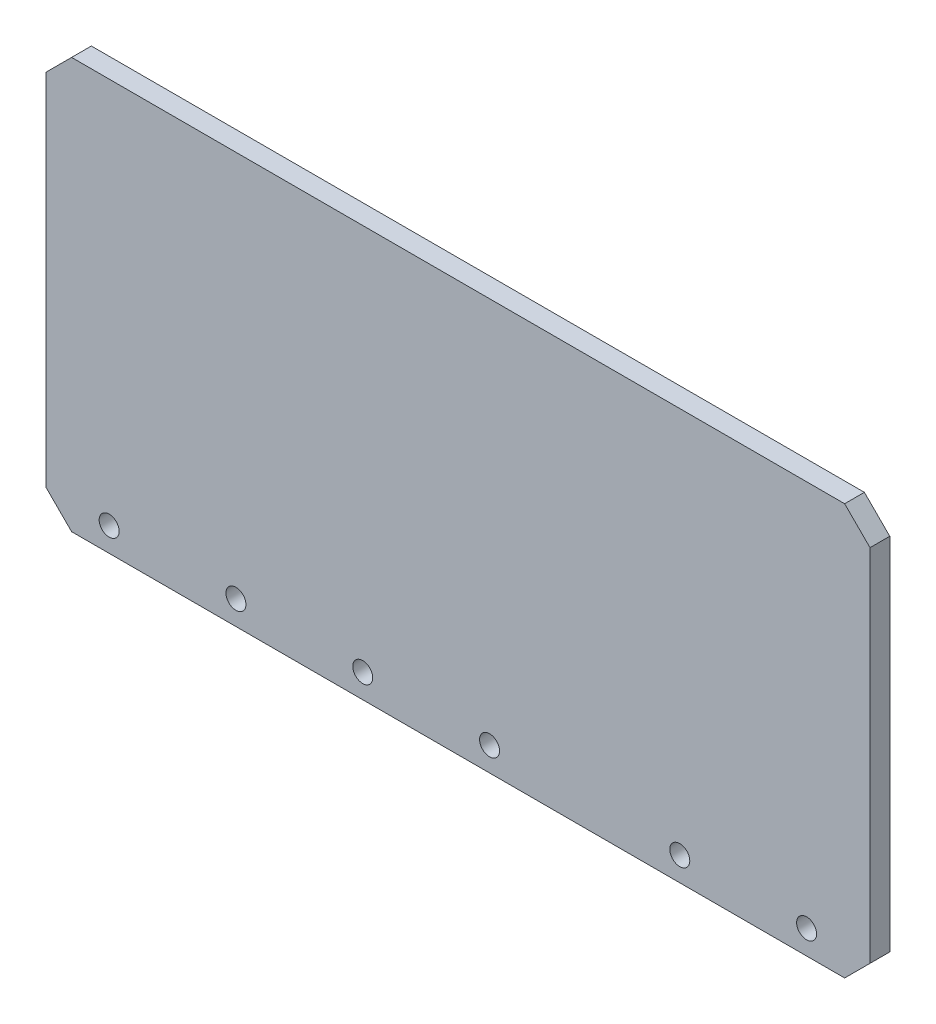
ISO-10303-21;
HEADER;
FILE_DESCRIPTION(('STEP AP214'),'2;1');
FILE_NAME('part.step','',(''),(''),'','','');
FILE_SCHEMA(('AUTOMOTIVE_DESIGN { 1 0 10303 214 1 1 1 1 }'));
ENDSEC;
DATA;
#1=APPLICATION_CONTEXT('core data for automotive mechanical design processes');
#2=APPLICATION_PROTOCOL_DEFINITION('international standard','automotive_design',2000,#1);
#3=PRODUCT_CONTEXT('',#1,'mechanical');
#4=PRODUCT('Part','Part','',(#3));
#5=PRODUCT_RELATED_PRODUCT_CATEGORY('part','',(#4));
#6=PRODUCT_DEFINITION_FORMATION('','',#4);
#7=PRODUCT_DEFINITION_CONTEXT('part definition',#1,'design');
#8=PRODUCT_DEFINITION('design','',#6,#7);
#9=PRODUCT_DEFINITION_SHAPE('','',#8);
#10=(LENGTH_UNIT() NAMED_UNIT(*) SI_UNIT(.MILLI.,.METRE.));
#11=(NAMED_UNIT(*) PLANE_ANGLE_UNIT() SI_UNIT($,.RADIAN.));
#12=(NAMED_UNIT(*) SI_UNIT($,.STERADIAN.) SOLID_ANGLE_UNIT());
#13=UNCERTAINTY_MEASURE_WITH_UNIT(LENGTH_MEASURE(1.E-05),#10,'distance_accuracy_value','');
#14=(GEOMETRIC_REPRESENTATION_CONTEXT(3) GLOBAL_UNCERTAINTY_ASSIGNED_CONTEXT((#13)) GLOBAL_UNIT_ASSIGNED_CONTEXT((#10,
#11,#12)) REPRESENTATION_CONTEXT('',''));
#15=CARTESIAN_POINT('',(0.,0.,0.));
#16=DIRECTION('',(0.,0.,1.));
#17=DIRECTION('',(1.,0.,0.));
#18=AXIS2_PLACEMENT_3D('',#15,#16,#17);
#19=CARTESIAN_POINT('',(69.39779872,110.92688762,0.));
#20=DIRECTION('',(0.,0.,1.));
#21=DIRECTION('',(1.,0.,0.));
#22=AXIS2_PLACEMENT_3D('',#19,#20,#21);
#23=PLANE('',#22);
#24=DIRECTION('',(-0.707106781186548,-0.707106781186548,0.));
#25=VECTOR('',#24,1.);
#26=CARTESIAN_POINT('',(70.41379872,126.36488762,0.));
#27=LINE('',#26,#25);
#28=CARTESIAN_POINT('',(69.39779872,125.34888762,0.));
#29=VERTEX_POINT('',#28);
#30=CARTESIAN_POINT('',(70.41379872,126.36488762,0.));
#31=VERTEX_POINT('',#30);
#32=EDGE_CURVE('E338',#29,#31,#27,.F.);
#33=ORIENTED_EDGE('',*,*,#32,.F.);
#34=DIRECTION('',(0.,1.,0.));
#35=VECTOR('',#34,1.);
#36=CARTESIAN_POINT('',(69.39779872,110.92688762,0.));
#37=LINE('',#36,#35);
#38=CARTESIAN_POINT('',(69.39779872,110.92688762,0.));
#39=VERTEX_POINT('',#38);
#40=EDGE_CURVE('E345',#39,#29,#37,.T.);
#41=ORIENTED_EDGE('',*,*,#40,.F.);
#42=DIRECTION('',(0.707106781186548,-0.707106781186548,0.));
#43=VECTOR('',#42,1.);
#44=CARTESIAN_POINT('',(70.41379872,109.91088762,0.));
#45=LINE('',#44,#43);
#46=CARTESIAN_POINT('',(70.41379872,109.91088762,0.));
#47=VERTEX_POINT('',#46);
#48=EDGE_CURVE('E349',#47,#39,#45,.F.);
#49=ORIENTED_EDGE('',*,*,#48,.F.);
#50=DIRECTION('',(1.,0.,0.));
#51=VECTOR('',#50,1.);
#52=CARTESIAN_POINT('',(108.3818,109.91088762,0.));
#53=LINE('',#52,#51);
#54=CARTESIAN_POINT('',(101.38179872,109.91088762,0.));
#55=VERTEX_POINT('',#54);
#56=EDGE_CURVE('E85',#55,#47,#53,.F.);
#57=ORIENTED_EDGE('',*,*,#56,.F.);
#58=DIRECTION('',(0.707106781186548,0.707106781186548,0.));
#59=VECTOR('',#58,1.);
#60=CARTESIAN_POINT('',(101.38179872,109.91088762,0.));
#61=LINE('',#60,#59);
#62=CARTESIAN_POINT('',(102.39779872,110.92688762,0.));
#63=VERTEX_POINT('',#62);
#64=EDGE_CURVE('E81',#63,#55,#61,.F.);
#65=ORIENTED_EDGE('',*,*,#64,.F.);
#66=DIRECTION('',(0.,1.,0.));
#67=VECTOR('',#66,1.);
#68=CARTESIAN_POINT('',(102.39779872,126.36488762,0.));
#69=LINE('',#68,#67);
#70=CARTESIAN_POINT('',(102.39779872,125.34888762,0.));
#71=VERTEX_POINT('',#70);
#72=EDGE_CURVE('E78',#63,#71,#69,.T.);
#73=ORIENTED_EDGE('',*,*,#72,.T.);
#74=DIRECTION('',(0.707106781186548,-0.707106781186548,0.));
#75=VECTOR('',#74,1.);
#76=CARTESIAN_POINT('',(102.39779872,125.34888762,0.));
#77=LINE('',#76,#75);
#78=CARTESIAN_POINT('',(101.38179872,126.36488762,0.));
#79=VERTEX_POINT('',#78);
#80=EDGE_CURVE('E329',#71,#79,#77,.F.);
#81=ORIENTED_EDGE('',*,*,#80,.T.);
#82=DIRECTION('',(1.,0.,0.));
#83=VECTOR('',#82,1.);
#84=CARTESIAN_POINT('',(69.39779872,126.36488762,0.));
#85=LINE('',#84,#83);
#86=EDGE_CURVE('E335',#79,#31,#85,.F.);
#87=ORIENTED_EDGE('',*,*,#86,.T.);
#88=EDGE_LOOP('',(#33,#41,#49,#57,#65,#73,#81,#87));
#89=FACE_BOUND('',#88,.T.);
#90=CARTESIAN_POINT('',(99.85779872,110.87288762,0.));
#91=DIRECTION('',(0.,0.,1.));
#92=DIRECTION('',(1.,0.,0.));
#93=AXIS2_PLACEMENT_3D('',#90,#91,#92);
#94=CIRCLE('',#93,0.4);
#95=CARTESIAN_POINT('',(100.25779872,110.87288762,0.));
#96=VERTEX_POINT('',#95);
#97=EDGE_CURVE('E91',#96,#96,#94,.F.);
#98=ORIENTED_EDGE('',*,*,#97,.T.);
#99=EDGE_LOOP('',(#98));
#100=FACE_BOUND('',#99,.T.);
#101=CARTESIAN_POINT('',(94.77779872,110.87288762,0.));
#102=DIRECTION('',(0.,0.,1.));
#103=DIRECTION('',(1.,0.,0.));
#104=AXIS2_PLACEMENT_3D('',#101,#102,#103);
#105=CIRCLE('',#104,0.4);
#106=CARTESIAN_POINT('',(95.17779872,110.87288762,0.));
#107=VERTEX_POINT('',#106);
#108=EDGE_CURVE('E126',#107,#107,#105,.F.);
#109=ORIENTED_EDGE('',*,*,#108,.T.);
#110=EDGE_LOOP('',(#109));
#111=FACE_BOUND('',#110,.T.);
#112=CARTESIAN_POINT('',(87.15779872,110.87288762,0.));
#113=DIRECTION('',(0.,0.,1.));
#114=DIRECTION('',(1.,0.,0.));
#115=AXIS2_PLACEMENT_3D('',#112,#113,#114);
#116=CIRCLE('',#115,0.4);
#117=CARTESIAN_POINT('',(87.55779872,110.87288762,0.));
#118=VERTEX_POINT('',#117);
#119=EDGE_CURVE('E129',#118,#118,#116,.F.);
#120=ORIENTED_EDGE('',*,*,#119,.T.);
#121=EDGE_LOOP('',(#120));
#122=FACE_BOUND('',#121,.T.);
#123=CARTESIAN_POINT('',(82.07779872,110.87288762,0.));
#124=DIRECTION('',(0.,0.,1.));
#125=DIRECTION('',(1.,0.,0.));
#126=AXIS2_PLACEMENT_3D('',#123,#124,#125);
#127=CIRCLE('',#126,0.4);
#128=CARTESIAN_POINT('',(82.47779872,110.87288762,0.));
#129=VERTEX_POINT('',#128);
#130=EDGE_CURVE('E132',#129,#129,#127,.F.);
#131=ORIENTED_EDGE('',*,*,#130,.T.);
#132=EDGE_LOOP('',(#131));
#133=FACE_BOUND('',#132,.T.);
#134=CARTESIAN_POINT('',(76.99779872,110.87288762,0.));
#135=DIRECTION('',(0.,0.,1.));
#136=DIRECTION('',(1.,0.,0.));
#137=AXIS2_PLACEMENT_3D('',#134,#135,#136);
#138=CIRCLE('',#137,0.4);
#139=CARTESIAN_POINT('',(77.39779872,110.87288762,0.));
#140=VERTEX_POINT('',#139);
#141=EDGE_CURVE('E134',#140,#140,#138,.F.);
#142=ORIENTED_EDGE('',*,*,#141,.T.);
#143=EDGE_LOOP('',(#142));
#144=FACE_BOUND('',#143,.T.);
#145=CARTESIAN_POINT('',(71.91779872,110.87288762,0.));
#146=DIRECTION('',(0.,0.,1.));
#147=DIRECTION('',(1.,0.,0.));
#148=AXIS2_PLACEMENT_3D('',#145,#146,#147);
#149=CIRCLE('',#148,0.4);
#150=CARTESIAN_POINT('',(72.31779872,110.87288762,0.));
#151=VERTEX_POINT('',#150);
#152=EDGE_CURVE('E20',#151,#151,#149,.F.);
#153=ORIENTED_EDGE('',*,*,#152,.T.);
#154=EDGE_LOOP('',(#153));
#155=FACE_BOUND('',#154,.T.);
#156=ADVANCED_FACE('F17',(#89,#100,#111,#122,#133,#144,#155),#23,.T.);
#157=CARTESIAN_POINT('',(71.91779872,110.87288762,-0.7911211));
#158=DIRECTION('',(0.,0.,1.));
#159=DIRECTION('',(1.,0.,0.));
#160=AXIS2_PLACEMENT_3D('',#157,#158,#159);
#161=CYLINDRICAL_SURFACE('',#160,0.4);
#162=CARTESIAN_POINT('',(71.91779872,110.87288762,-0.7911211));
#163=DIRECTION('',(0.,0.,1.));
#164=DIRECTION('',(1.,0.,0.));
#165=AXIS2_PLACEMENT_3D('',#162,#163,#164);
#166=CIRCLE('',#165,0.4);
#167=CARTESIAN_POINT('',(72.31779872,110.87288762,-0.7911211));
#168=VERTEX_POINT('',#167);
#169=EDGE_CURVE('E121',#168,#168,#166,.F.);
#170=ORIENTED_EDGE('',*,*,#169,.T.);
#171=EDGE_LOOP('',(#170));
#172=FACE_BOUND('',#171,.T.);
#173=ORIENTED_EDGE('',*,*,#152,.F.);
#174=EDGE_LOOP('',(#173));
#175=FACE_BOUND('',#174,.T.);
#176=ADVANCED_FACE('F142',(#172,#175),#161,.F.);
#177=CARTESIAN_POINT('',(76.99779872,110.87288762,-0.7911211));
#178=DIRECTION('',(0.,0.,1.));
#179=DIRECTION('',(1.,0.,0.));
#180=AXIS2_PLACEMENT_3D('',#177,#178,#179);
#181=CYLINDRICAL_SURFACE('',#180,0.4);
#182=CARTESIAN_POINT('',(76.99779872,110.87288762,-0.7911211));
#183=DIRECTION('',(0.,0.,1.));
#184=DIRECTION('',(1.,0.,0.));
#185=AXIS2_PLACEMENT_3D('',#182,#183,#184);
#186=CIRCLE('',#185,0.4);
#187=CARTESIAN_POINT('',(77.39779872,110.87288762,-0.7911211));
#188=VERTEX_POINT('',#187);
#189=EDGE_CURVE('E118',#188,#188,#186,.F.);
#190=ORIENTED_EDGE('',*,*,#189,.T.);
#191=EDGE_LOOP('',(#190));
#192=FACE_BOUND('',#191,.T.);
#193=ORIENTED_EDGE('',*,*,#141,.F.);
#194=EDGE_LOOP('',(#193));
#195=FACE_BOUND('',#194,.T.);
#196=ADVANCED_FACE('F144',(#192,#195),#181,.F.);
#197=CARTESIAN_POINT('',(82.07779872,110.87288762,-0.7911211));
#198=DIRECTION('',(0.,0.,1.));
#199=DIRECTION('',(1.,0.,0.));
#200=AXIS2_PLACEMENT_3D('',#197,#198,#199);
#201=CYLINDRICAL_SURFACE('',#200,0.4);
#202=CARTESIAN_POINT('',(82.07779872,110.87288762,-0.7911211));
#203=DIRECTION('',(0.,0.,1.));
#204=DIRECTION('',(1.,0.,0.));
#205=AXIS2_PLACEMENT_3D('',#202,#203,#204);
#206=CIRCLE('',#205,0.4);
#207=CARTESIAN_POINT('',(82.47779872,110.87288762,-0.7911211));
#208=VERTEX_POINT('',#207);
#209=EDGE_CURVE('E115',#208,#208,#206,.F.);
#210=ORIENTED_EDGE('',*,*,#209,.T.);
#211=EDGE_LOOP('',(#210));
#212=FACE_BOUND('',#211,.T.);
#213=ORIENTED_EDGE('',*,*,#130,.F.);
#214=EDGE_LOOP('',(#213));
#215=FACE_BOUND('',#214,.T.);
#216=ADVANCED_FACE('F151',(#212,#215),#201,.F.);
#217=CARTESIAN_POINT('',(87.15779872,110.87288762,-0.7911211));
#218=DIRECTION('',(0.,0.,1.));
#219=DIRECTION('',(1.,0.,0.));
#220=AXIS2_PLACEMENT_3D('',#217,#218,#219);
#221=CYLINDRICAL_SURFACE('',#220,0.4);
#222=CARTESIAN_POINT('',(87.15779872,110.87288762,-0.7911211));
#223=DIRECTION('',(0.,0.,1.));
#224=DIRECTION('',(1.,0.,0.));
#225=AXIS2_PLACEMENT_3D('',#222,#223,#224);
#226=CIRCLE('',#225,0.4);
#227=CARTESIAN_POINT('',(87.55779872,110.87288762,-0.7911211));
#228=VERTEX_POINT('',#227);
#229=EDGE_CURVE('E112',#228,#228,#226,.F.);
#230=ORIENTED_EDGE('',*,*,#229,.T.);
#231=EDGE_LOOP('',(#230));
#232=FACE_BOUND('',#231,.T.);
#233=ORIENTED_EDGE('',*,*,#119,.F.);
#234=EDGE_LOOP('',(#233));
#235=FACE_BOUND('',#234,.T.);
#236=ADVANCED_FACE('F197',(#232,#235),#221,.F.);
#237=CARTESIAN_POINT('',(94.77779872,110.87288762,-0.7911211));
#238=DIRECTION('',(0.,0.,1.));
#239=DIRECTION('',(1.,0.,0.));
#240=AXIS2_PLACEMENT_3D('',#237,#238,#239);
#241=CYLINDRICAL_SURFACE('',#240,0.4);
#242=CARTESIAN_POINT('',(94.77779872,110.87288762,-0.7911211));
#243=DIRECTION('',(0.,0.,1.));
#244=DIRECTION('',(1.,0.,0.));
#245=AXIS2_PLACEMENT_3D('',#242,#243,#244);
#246=CIRCLE('',#245,0.4);
#247=CARTESIAN_POINT('',(95.17779872,110.87288762,-0.7911211));
#248=VERTEX_POINT('',#247);
#249=EDGE_CURVE('E109',#248,#248,#246,.F.);
#250=ORIENTED_EDGE('',*,*,#249,.T.);
#251=EDGE_LOOP('',(#250));
#252=FACE_BOUND('',#251,.T.);
#253=ORIENTED_EDGE('',*,*,#108,.F.);
#254=EDGE_LOOP('',(#253));
#255=FACE_BOUND('',#254,.T.);
#256=ADVANCED_FACE('F193',(#252,#255),#241,.F.);
#257=CARTESIAN_POINT('',(99.85779872,110.87288762,-0.7911211));
#258=DIRECTION('',(0.,0.,1.));
#259=DIRECTION('',(1.,0.,0.));
#260=AXIS2_PLACEMENT_3D('',#257,#258,#259);
#261=CYLINDRICAL_SURFACE('',#260,0.4);
#262=CARTESIAN_POINT('',(99.85779872,110.87288762,-0.7911211));
#263=DIRECTION('',(0.,0.,1.));
#264=DIRECTION('',(1.,0.,0.));
#265=AXIS2_PLACEMENT_3D('',#262,#263,#264);
#266=CIRCLE('',#265,0.4);
#267=CARTESIAN_POINT('',(100.25779872,110.87288762,-0.7911211));
#268=VERTEX_POINT('',#267);
#269=EDGE_CURVE('E106',#268,#268,#266,.F.);
#270=ORIENTED_EDGE('',*,*,#269,.T.);
#271=EDGE_LOOP('',(#270));
#272=FACE_BOUND('',#271,.T.);
#273=ORIENTED_EDGE('',*,*,#97,.F.);
#274=EDGE_LOOP('',(#273));
#275=FACE_BOUND('',#274,.T.);
#276=ADVANCED_FACE('F190',(#272,#275),#261,.F.);
#277=CARTESIAN_POINT('',(101.38179872,109.91088762,-0.7911211));
#278=DIRECTION('',(0.707106781186548,-0.707106781186548,0.));
#279=DIRECTION('',(0.707106781186548,0.707106781186548,0.));
#280=AXIS2_PLACEMENT_3D('',#277,#278,#279);
#281=PLANE('',#280);
#282=ORIENTED_EDGE('',*,*,#64,.T.);
#283=DIRECTION('',(0.,0.,-1.));
#284=VECTOR('',#283,1.);
#285=CARTESIAN_POINT('',(101.38179872,109.91088762,-0.7911211));
#286=LINE('',#285,#284);
#287=CARTESIAN_POINT('',(101.38179872,109.91088762,-0.7911211));
#288=VERTEX_POINT('',#287);
#289=EDGE_CURVE('E353',#288,#55,#286,.F.);
#290=ORIENTED_EDGE('',*,*,#289,.F.);
#291=DIRECTION('',(0.707106781186538,0.707106781186557,0.));
#292=VECTOR('',#291,1.);
#293=CARTESIAN_POINT('',(101.38179872,109.91088762,-0.7911211));
#294=LINE('',#293,#292);
#295=CARTESIAN_POINT('',(102.39779872,110.92688762,-0.7911211));
#296=VERTEX_POINT('',#295);
#297=EDGE_CURVE('E102',#288,#296,#294,.T.);
#298=ORIENTED_EDGE('',*,*,#297,.T.);
#299=DIRECTION('',(0.,0.,1.));
#300=VECTOR('',#299,1.);
#301=CARTESIAN_POINT('',(102.39779872,110.92688762,-0.7911211));
#302=LINE('',#301,#300);
#303=EDGE_CURVE('E90',#296,#63,#302,.T.);
#304=ORIENTED_EDGE('',*,*,#303,.T.);
#305=EDGE_LOOP('',(#282,#290,#298,#304));
#306=FACE_BOUND('',#305,.T.);
#307=ADVANCED_FACE('F101',(#306),#281,.T.);
#308=CARTESIAN_POINT('',(102.39779872,126.36488762,-0.7911211));
#309=DIRECTION('',(-1.,0.,0.));
#310=DIRECTION('',(0.,0.,1.));
#311=AXIS2_PLACEMENT_3D('',#308,#309,#310);
#312=PLANE('',#311);
#313=ORIENTED_EDGE('',*,*,#303,.F.);
#314=DIRECTION('',(0.,1.,0.));
#315=VECTOR('',#314,1.);
#316=CARTESIAN_POINT('',(102.39779872,110.92688762,-0.7911211));
#317=LINE('',#316,#315);
#318=CARTESIAN_POINT('',(102.39779872,125.34888762,-0.7911211));
#319=VERTEX_POINT('',#318);
#320=EDGE_CURVE('E358',#296,#319,#317,.T.);
#321=ORIENTED_EDGE('',*,*,#320,.T.);
#322=DIRECTION('',(0.,0.,1.));
#323=VECTOR('',#322,1.);
#324=CARTESIAN_POINT('',(102.39779872,125.34888762,-0.7911211));
#325=LINE('',#324,#323);
#326=EDGE_CURVE('E98',#319,#71,#325,.T.);
#327=ORIENTED_EDGE('',*,*,#326,.T.);
#328=ORIENTED_EDGE('',*,*,#72,.F.);
#329=EDGE_LOOP('',(#313,#321,#327,#328));
#330=FACE_BOUND('',#329,.T.);
#331=ADVANCED_FACE('F95',(#330),#312,.F.);
#332=CARTESIAN_POINT('',(102.39779872,125.34888762,-0.7911211));
#333=DIRECTION('',(-0.707106781186548,-0.707106781186548,0.));
#334=DIRECTION('',(0.707106781186548,-0.707106781186548,0.));
#335=AXIS2_PLACEMENT_3D('',#332,#333,#334);
#336=PLANE('',#335);
#337=DIRECTION('',(0.,0.,-1.));
#338=VECTOR('',#337,1.);
#339=CARTESIAN_POINT('',(101.38179872,126.36488762,-0.7911211));
#340=LINE('',#339,#338);
#341=CARTESIAN_POINT('',(101.38179872,126.36488762,-0.7911211));
#342=VERTEX_POINT('',#341);
#343=EDGE_CURVE('E328',#342,#79,#340,.F.);
#344=ORIENTED_EDGE('',*,*,#343,.T.);
#345=ORIENTED_EDGE('',*,*,#80,.F.);
#346=ORIENTED_EDGE('',*,*,#326,.F.);
#347=DIRECTION('',(-0.707106781186548,0.707106781186548,0.));
#348=VECTOR('',#347,1.);
#349=CARTESIAN_POINT('',(102.39779872,125.34888762,-0.7911211));
#350=LINE('',#349,#348);
#351=EDGE_CURVE('E331',#319,#342,#350,.T.);
#352=ORIENTED_EDGE('',*,*,#351,.T.);
#353=EDGE_LOOP('',(#344,#345,#346,#352));
#354=FACE_BOUND('',#353,.T.);
#355=ADVANCED_FACE('F181',(#354),#336,.F.);
#356=CARTESIAN_POINT('',(69.39779872,126.36488762,-0.7911211));
#357=DIRECTION('',(0.,-1.,0.));
#358=DIRECTION('',(0.,0.,-1.));
#359=AXIS2_PLACEMENT_3D('',#356,#357,#358);
#360=PLANE('',#359);
#361=ORIENTED_EDGE('',*,*,#343,.F.);
#362=DIRECTION('',(1.,0.,0.));
#363=VECTOR('',#362,1.);
#364=CARTESIAN_POINT('',(69.39779872,126.36488762,-0.7911211));
#365=LINE('',#364,#363);
#366=CARTESIAN_POINT('',(70.41379872,126.36488762,-0.7911211));
#367=VERTEX_POINT('',#366);
#368=EDGE_CURVE('E361',#342,#367,#365,.F.);
#369=ORIENTED_EDGE('',*,*,#368,.T.);
#370=DIRECTION('',(0.,0.,1.));
#371=VECTOR('',#370,1.);
#372=CARTESIAN_POINT('',(70.41379872,126.36488762,-0.7911211));
#373=LINE('',#372,#371);
#374=EDGE_CURVE('E343',#31,#367,#373,.F.);
#375=ORIENTED_EDGE('',*,*,#374,.F.);
#376=ORIENTED_EDGE('',*,*,#86,.F.);
#377=EDGE_LOOP('',(#361,#369,#375,#376));
#378=FACE_BOUND('',#377,.T.);
#379=ADVANCED_FACE('F177',(#378),#360,.F.);
#380=CARTESIAN_POINT('',(70.41379872,126.36488762,-0.7911211));
#381=DIRECTION('',(-0.707106781186548,0.707106781186548,0.));
#382=DIRECTION('',(-0.707106781186548,-0.707106781186548,0.));
#383=AXIS2_PLACEMENT_3D('',#380,#381,#382);
#384=PLANE('',#383);
#385=ORIENTED_EDGE('',*,*,#32,.T.);
#386=ORIENTED_EDGE('',*,*,#374,.T.);
#387=DIRECTION('',(-0.707106781186552,-0.707106781186543,0.));
#388=VECTOR('',#387,1.);
#389=CARTESIAN_POINT('',(70.41379872,126.36488762,-0.7911211));
#390=LINE('',#389,#388);
#391=CARTESIAN_POINT('',(69.39779872,125.34888762,-0.7911211));
#392=VERTEX_POINT('',#391);
#393=EDGE_CURVE('E363',#367,#392,#390,.T.);
#394=ORIENTED_EDGE('',*,*,#393,.T.);
#395=DIRECTION('',(0.,0.,1.));
#396=VECTOR('',#395,1.);
#397=CARTESIAN_POINT('',(69.39779872,125.34888762,-0.7911211));
#398=LINE('',#397,#396);
#399=EDGE_CURVE('E347',#29,#392,#398,.F.);
#400=ORIENTED_EDGE('',*,*,#399,.F.);
#401=EDGE_LOOP('',(#385,#386,#394,#400));
#402=FACE_BOUND('',#401,.T.);
#403=ADVANCED_FACE('F173',(#402),#384,.T.);
#404=CARTESIAN_POINT('',(69.39779872,110.92688762,-0.7911211));
#405=DIRECTION('',(-1.,0.,0.));
#406=DIRECTION('',(0.,0.,1.));
#407=AXIS2_PLACEMENT_3D('',#404,#405,#406);
#408=PLANE('',#407);
#409=DIRECTION('',(0.,1.,0.));
#410=VECTOR('',#409,1.);
#411=CARTESIAN_POINT('',(69.39779872,110.92688762,-0.7911211));
#412=LINE('',#411,#410);
#413=CARTESIAN_POINT('',(69.39779872,110.92688762,-0.7911211));
#414=VERTEX_POINT('',#413);
#415=EDGE_CURVE('E366',#392,#414,#412,.F.);
#416=ORIENTED_EDGE('',*,*,#415,.T.);
#417=DIRECTION('',(0.,0.,1.));
#418=VECTOR('',#417,1.);
#419=CARTESIAN_POINT('',(69.39779872,110.92688762,-0.7911211));
#420=LINE('',#419,#418);
#421=EDGE_CURVE('E351',#39,#414,#420,.F.);
#422=ORIENTED_EDGE('',*,*,#421,.F.);
#423=ORIENTED_EDGE('',*,*,#40,.T.);
#424=ORIENTED_EDGE('',*,*,#399,.T.);
#425=EDGE_LOOP('',(#416,#422,#423,#424));
#426=FACE_BOUND('',#425,.T.);
#427=ADVANCED_FACE('F169',(#426),#408,.T.);
#428=CARTESIAN_POINT('',(70.41379872,109.91088762,-0.7911211));
#429=DIRECTION('',(-0.707106781186548,-0.707106781186548,0.));
#430=DIRECTION('',(0.707106781186548,-0.707106781186548,0.));
#431=AXIS2_PLACEMENT_3D('',#428,#429,#430);
#432=PLANE('',#431);
#433=ORIENTED_EDGE('',*,*,#48,.T.);
#434=ORIENTED_EDGE('',*,*,#421,.T.);
#435=DIRECTION('',(0.707106781186543,-0.707106781186552,0.));
#436=VECTOR('',#435,1.);
#437=CARTESIAN_POINT('',(69.39779872,110.92688762,-0.7911211));
#438=LINE('',#437,#436);
#439=CARTESIAN_POINT('',(70.41379872,109.91088762,-0.7911211));
#440=VERTEX_POINT('',#439);
#441=EDGE_CURVE('E26',#414,#440,#438,.T.);
#442=ORIENTED_EDGE('',*,*,#441,.T.);
#443=DIRECTION('',(0.,0.,-1.));
#444=VECTOR('',#443,1.);
#445=CARTESIAN_POINT('',(70.41379872,109.91088762,-0.7911211));
#446=LINE('',#445,#444);
#447=EDGE_CURVE('E34',#47,#440,#446,.T.);
#448=ORIENTED_EDGE('',*,*,#447,.F.);
#449=EDGE_LOOP('',(#433,#434,#442,#448));
#450=FACE_BOUND('',#449,.T.);
#451=ADVANCED_FACE('F162',(#450),#432,.T.);
#452=CARTESIAN_POINT('',(108.3818,109.91088762,-0.7911211));
#453=DIRECTION('',(0.,-1.,0.));
#454=DIRECTION('',(0.,0.,-1.));
#455=AXIS2_PLACEMENT_3D('',#452,#453,#454);
#456=PLANE('',#455);
#457=ORIENTED_EDGE('',*,*,#56,.T.);
#458=ORIENTED_EDGE('',*,*,#447,.T.);
#459=DIRECTION('',(1.,0.,0.));
#460=VECTOR('',#459,1.);
#461=CARTESIAN_POINT('',(69.39779872,109.91088762,-0.7911211));
#462=LINE('',#461,#460);
#463=EDGE_CURVE('E11',#440,#288,#462,.T.);
#464=ORIENTED_EDGE('',*,*,#463,.T.);
#465=ORIENTED_EDGE('',*,*,#289,.T.);
#466=EDGE_LOOP('',(#457,#458,#464,#465));
#467=FACE_BOUND('',#466,.T.);
#468=ADVANCED_FACE('F156',(#467),#456,.T.);
#469=CARTESIAN_POINT('',(69.39779872,110.92688762,-0.7911211));
#470=DIRECTION('',(0.,0.,1.));
#471=DIRECTION('',(1.,0.,0.));
#472=AXIS2_PLACEMENT_3D('',#469,#470,#471);
#473=PLANE('',#472);
#474=ORIENTED_EDGE('',*,*,#441,.F.);
#475=ORIENTED_EDGE('',*,*,#415,.F.);
#476=ORIENTED_EDGE('',*,*,#393,.F.);
#477=ORIENTED_EDGE('',*,*,#368,.F.);
#478=ORIENTED_EDGE('',*,*,#351,.F.);
#479=ORIENTED_EDGE('',*,*,#320,.F.);
#480=ORIENTED_EDGE('',*,*,#297,.F.);
#481=ORIENTED_EDGE('',*,*,#463,.F.);
#482=EDGE_LOOP('',(#474,#475,#476,#477,#478,#479,#480,#481));
#483=FACE_BOUND('',#482,.T.);
#484=ORIENTED_EDGE('',*,*,#269,.F.);
#485=EDGE_LOOP('',(#484));
#486=FACE_BOUND('',#485,.T.);
#487=ORIENTED_EDGE('',*,*,#249,.F.);
#488=EDGE_LOOP('',(#487));
#489=FACE_BOUND('',#488,.T.);
#490=ORIENTED_EDGE('',*,*,#229,.F.);
#491=EDGE_LOOP('',(#490));
#492=FACE_BOUND('',#491,.T.);
#493=ORIENTED_EDGE('',*,*,#209,.F.);
#494=EDGE_LOOP('',(#493));
#495=FACE_BOUND('',#494,.T.);
#496=ORIENTED_EDGE('',*,*,#189,.F.);
#497=EDGE_LOOP('',(#496));
#498=FACE_BOUND('',#497,.T.);
#499=ORIENTED_EDGE('',*,*,#169,.F.);
#500=EDGE_LOOP('',(#499));
#501=FACE_BOUND('',#500,.T.);
#502=ADVANCED_FACE('F154',(#483,#486,#489,#492,#495,#498,#501),#473,.F.);
#503=CLOSED_SHELL('',(#156,#176,#196,#216,#236,#256,#276,#307,#331,#355,#379,#403,#427,#451,
#468,#502));
#504=MANIFOLD_SOLID_BREP('B1',#503);
#505=ADVANCED_BREP_SHAPE_REPRESENTATION('',(#18,#504),#14);
#506=SHAPE_DEFINITION_REPRESENTATION(#9,#505);
ENDSEC;
END-ISO-10303-21;
